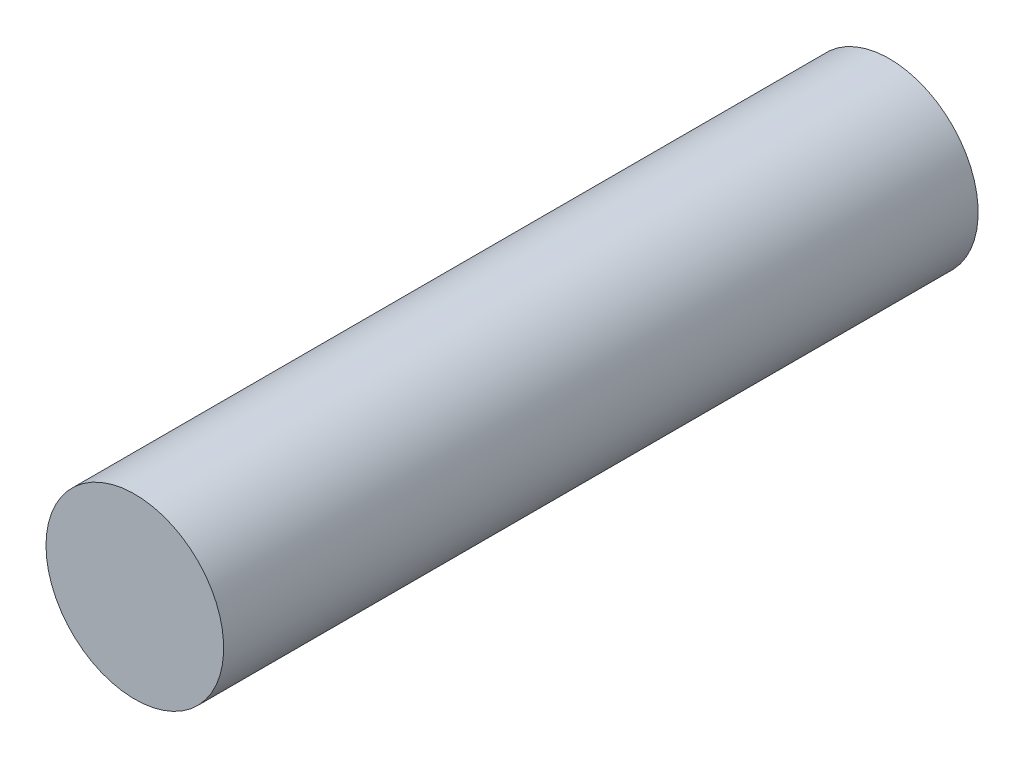
ISO-10303-21;
HEADER;
FILE_DESCRIPTION(('STEP AP214'),'2;1');
FILE_NAME('part.step','',(''),(''),'','','');
FILE_SCHEMA(('AUTOMOTIVE_DESIGN { 1 0 10303 214 1 1 1 1 }'));
ENDSEC;
DATA;
#1=APPLICATION_CONTEXT('core data for automotive mechanical design processes');
#2=APPLICATION_PROTOCOL_DEFINITION('international standard','automotive_design',2000,#1);
#3=PRODUCT_CONTEXT('',#1,'mechanical');
#4=PRODUCT('Part','Part','',(#3));
#5=PRODUCT_RELATED_PRODUCT_CATEGORY('part','',(#4));
#6=PRODUCT_DEFINITION_FORMATION('','',#4);
#7=PRODUCT_DEFINITION_CONTEXT('part definition',#1,'design');
#8=PRODUCT_DEFINITION('design','',#6,#7);
#9=PRODUCT_DEFINITION_SHAPE('','',#8);
#10=(LENGTH_UNIT() NAMED_UNIT(*) SI_UNIT(.MILLI.,.METRE.));
#11=(NAMED_UNIT(*) PLANE_ANGLE_UNIT() SI_UNIT($,.RADIAN.));
#12=(NAMED_UNIT(*) SI_UNIT($,.STERADIAN.) SOLID_ANGLE_UNIT());
#13=UNCERTAINTY_MEASURE_WITH_UNIT(LENGTH_MEASURE(1.E-05),#10,'distance_accuracy_value','');
#14=(GEOMETRIC_REPRESENTATION_CONTEXT(3) GLOBAL_UNCERTAINTY_ASSIGNED_CONTEXT((#13)) GLOBAL_UNIT_ASSIGNED_CONTEXT((#10,
#11,#12)) REPRESENTATION_CONTEXT('',''));
#15=CARTESIAN_POINT('',(0.,0.,0.));
#16=DIRECTION('',(0.,0.,1.));
#17=DIRECTION('',(1.,0.,0.));
#18=AXIS2_PLACEMENT_3D('',#15,#16,#17);
#19=CARTESIAN_POINT('',(0.,0.,27.6));
#20=DIRECTION('',(0.,0.,-1.));
#21=DIRECTION('',(-1.,0.,0.));
#22=AXIS2_PLACEMENT_3D('',#19,#20,#21);
#23=CYLINDRICAL_SURFACE('',#22,3.25);
#24=CARTESIAN_POINT('',(0.,0.,27.6));
#25=DIRECTION('',(0.,0.,1.));
#26=DIRECTION('',(1.,0.,0.));
#27=AXIS2_PLACEMENT_3D('',#24,#25,#26);
#28=CIRCLE('',#27,3.25);
#29=CARTESIAN_POINT('',(-3.25,0.,27.6));
#30=VERTEX_POINT('',#29);
#31=EDGE_CURVE('E10',#30,#30,#28,.T.);
#32=CARTESIAN_POINT('',(0.,0.,0.));
#33=DIRECTION('',(0.,0.,1.));
#34=DIRECTION('',(1.,0.,0.));
#35=AXIS2_PLACEMENT_3D('',#32,#33,#34);
#36=CIRCLE('',#35,3.25);
#37=CARTESIAN_POINT('',(-3.25,0.,0.));
#38=VERTEX_POINT('',#37);
#39=EDGE_CURVE('E35',#38,#38,#36,.T.);
#40=CARTESIAN_POINT('',(-3.25,0.,27.6));
#41=CARTESIAN_POINT('',(-3.25,0.,27.3125));
#42=CARTESIAN_POINT('',(-3.25,0.,27.025));
#43=CARTESIAN_POINT('',(-3.25,0.,26.45));
#44=CARTESIAN_POINT('',(-3.25,0.,26.1625));
#45=CARTESIAN_POINT('',(-3.25,0.,25.5875));
#46=CARTESIAN_POINT('',(-3.25,0.,25.3));
#47=CARTESIAN_POINT('',(-3.25,0.,24.725));
#48=CARTESIAN_POINT('',(-3.25,0.,24.4375));
#49=CARTESIAN_POINT('',(-3.25,0.,23.8625));
#50=CARTESIAN_POINT('',(-3.25,0.,23.575));
#51=CARTESIAN_POINT('',(-3.25,0.,23.));
#52=CARTESIAN_POINT('',(-3.25,0.,22.7125));
#53=CARTESIAN_POINT('',(-3.25,0.,22.1375));
#54=CARTESIAN_POINT('',(-3.25,0.,21.85));
#55=CARTESIAN_POINT('',(-3.25,0.,21.275));
#56=CARTESIAN_POINT('',(-3.25,0.,20.9875));
#57=CARTESIAN_POINT('',(-3.25,0.,20.4125));
#58=CARTESIAN_POINT('',(-3.25,0.,20.125));
#59=CARTESIAN_POINT('',(-3.25,0.,19.55));
#60=CARTESIAN_POINT('',(-3.25,0.,19.2625));
#61=CARTESIAN_POINT('',(-3.25,0.,18.6875));
#62=CARTESIAN_POINT('',(-3.25,0.,18.4));
#63=CARTESIAN_POINT('',(-3.25,0.,17.825));
#64=CARTESIAN_POINT('',(-3.25,0.,17.5375));
#65=CARTESIAN_POINT('',(-3.25,0.,16.9625));
#66=CARTESIAN_POINT('',(-3.25,0.,16.675));
#67=CARTESIAN_POINT('',(-3.25,0.,16.1));
#68=CARTESIAN_POINT('',(-3.25,0.,15.8125));
#69=CARTESIAN_POINT('',(-3.25,0.,15.2375));
#70=CARTESIAN_POINT('',(-3.25,0.,14.95));
#71=CARTESIAN_POINT('',(-3.25,0.,14.375));
#72=CARTESIAN_POINT('',(-3.25,0.,14.0875));
#73=CARTESIAN_POINT('',(-3.25,0.,13.5125));
#74=CARTESIAN_POINT('',(-3.25,0.,13.225));
#75=CARTESIAN_POINT('',(-3.25,0.,12.65));
#76=CARTESIAN_POINT('',(-3.25,0.,12.3625));
#77=CARTESIAN_POINT('',(-3.25,0.,11.7875));
#78=CARTESIAN_POINT('',(-3.25,0.,11.5));
#79=CARTESIAN_POINT('',(-3.25,0.,10.925));
#80=CARTESIAN_POINT('',(-3.25,0.,10.6375));
#81=CARTESIAN_POINT('',(-3.25,0.,10.0625));
#82=CARTESIAN_POINT('',(-3.25,0.,9.775));
#83=CARTESIAN_POINT('',(-3.25,0.,9.2));
#84=CARTESIAN_POINT('',(-3.25,0.,8.9125));
#85=CARTESIAN_POINT('',(-3.25,0.,8.3375));
#86=CARTESIAN_POINT('',(-3.25,0.,8.05));
#87=CARTESIAN_POINT('',(-3.25,0.,7.475));
#88=CARTESIAN_POINT('',(-3.25,0.,7.1875));
#89=CARTESIAN_POINT('',(-3.25,0.,6.6125));
#90=CARTESIAN_POINT('',(-3.25,0.,6.325));
#91=CARTESIAN_POINT('',(-3.25,0.,5.75));
#92=CARTESIAN_POINT('',(-3.25,0.,5.4625));
#93=CARTESIAN_POINT('',(-3.25,0.,4.8875));
#94=CARTESIAN_POINT('',(-3.25,0.,4.6));
#95=CARTESIAN_POINT('',(-3.25,0.,4.025));
#96=CARTESIAN_POINT('',(-3.25,0.,3.7375));
#97=CARTESIAN_POINT('',(-3.25,0.,3.1625));
#98=CARTESIAN_POINT('',(-3.25,0.,2.875));
#99=CARTESIAN_POINT('',(-3.25,0.,2.3));
#100=CARTESIAN_POINT('',(-3.25,0.,2.0125));
#101=CARTESIAN_POINT('',(-3.25,0.,1.4375));
#102=CARTESIAN_POINT('',(-3.25,0.,1.15));
#103=CARTESIAN_POINT('',(-3.25,0.,0.574999999999999));
#104=CARTESIAN_POINT('',(-3.25,0.,0.287499999999999));
#105=CARTESIAN_POINT('',(-3.25,0.,0.));
#106=B_SPLINE_CURVE_WITH_KNOTS('',3,(#40,#41,#42,#43,#44,#45,#46,#47,#48,#49,#50,#51,#52,#53,
#54,#55,#56,#57,#58,#59,#60,#61,#62,#63,#64,#65,#66,#67,#68,#69,#70,#71,#72,#73,#74,#75,#76,#77,
#78,#79,#80,#81,#82,#83,#84,#85,#86,#87,#88,#89,#90,#91,#92,#93,#94,#95,#96,#97,#98,#99,#100,
#101,#102,#103,#104,#105),.UNSPECIFIED.,.F.,.F.,(4,2,2,2,2,2,2,2,2,2,2,2,2,2,2,2,2,2,2,2,2,2,2,
2,2,2,2,2,2,2,2,2,4),(0.,0.862499999999999,1.725,2.5875,3.45,4.3125,5.175,6.0375,6.9,7.7625,
8.625,9.4875,10.35,11.2125,12.075,12.9375,13.8,14.6625,15.525,16.3875,17.25,18.1125,18.975,
19.8375,20.7,21.5625,22.425,23.2875,24.15,25.0125,25.875,26.7375,27.6),.UNSPECIFIED.);
#107=EDGE_CURVE('BSEAM32',#30,#38,#106,.T.);
#108=ORIENTED_EDGE('',*,*,#31,.F.);
#109=ORIENTED_EDGE('',*,*,#39,.T.);
#110=ORIENTED_EDGE('',*,*,#107,.T.);
#111=ORIENTED_EDGE('',*,*,#107,.F.);
#112=EDGE_LOOP('',(#108,#110,#109,#111));
#113=FACE_BOUND('',#112,.T.);
#114=ADVANCED_FACE('F32',(#113),#23,.T.);
#115=CARTESIAN_POINT('',(0.,0.,27.6));
#116=DIRECTION('',(0.,0.,1.));
#117=DIRECTION('',(1.,0.,0.));
#118=AXIS2_PLACEMENT_3D('',#115,#116,#117);
#119=PLANE('',#118);
#120=ORIENTED_EDGE('',*,*,#31,.T.);
#121=EDGE_LOOP('',(#120));
#122=FACE_BOUND('',#121,.T.);
#123=ADVANCED_FACE('F47',(#122),#119,.T.);
#124=CARTESIAN_POINT('',(0.,0.,0.));
#125=DIRECTION('',(0.,0.,1.));
#126=DIRECTION('',(1.,0.,0.));
#127=AXIS2_PLACEMENT_3D('',#124,#125,#126);
#128=PLANE('',#127);
#129=ORIENTED_EDGE('',*,*,#39,.F.);
#130=EDGE_LOOP('',(#129));
#131=FACE_BOUND('',#130,.T.);
#132=ADVANCED_FACE('F45',(#131),#128,.F.);
#133=CLOSED_SHELL('',(#114,#123,#132));
#134=MANIFOLD_SOLID_BREP('B2',#133);
#135=ADVANCED_BREP_SHAPE_REPRESENTATION('',(#18,#134),#14);
#136=SHAPE_DEFINITION_REPRESENTATION(#9,#135);
ENDSEC;
END-ISO-10303-21;
